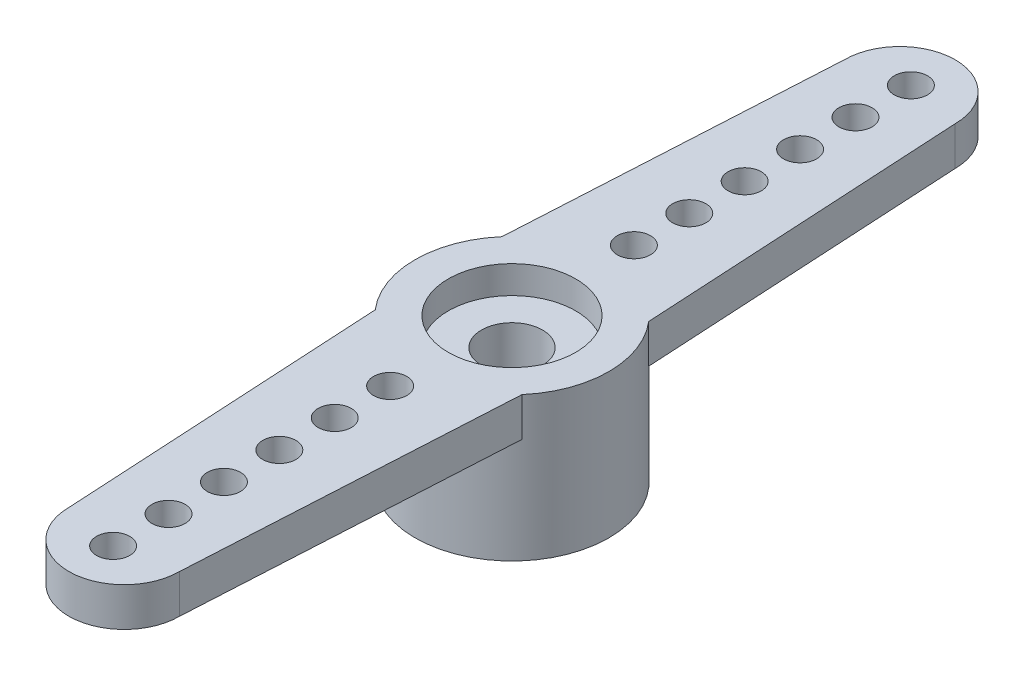
ISO-10303-21;
HEADER;
FILE_DESCRIPTION(('STEP AP214'),'2;1');
FILE_NAME('part.step','',(''),(''),'','','');
FILE_SCHEMA(('AUTOMOTIVE_DESIGN { 1 0 10303 214 1 1 1 1 }'));
ENDSEC;
DATA;
#1=APPLICATION_CONTEXT('core data for automotive mechanical design processes');
#2=APPLICATION_PROTOCOL_DEFINITION('international standard','automotive_design',2000,#1);
#3=PRODUCT_CONTEXT('',#1,'mechanical');
#4=PRODUCT('Part','Part','',(#3));
#5=PRODUCT_RELATED_PRODUCT_CATEGORY('part','',(#4));
#6=PRODUCT_DEFINITION_FORMATION('','',#4);
#7=PRODUCT_DEFINITION_CONTEXT('part definition',#1,'design');
#8=PRODUCT_DEFINITION('design','',#6,#7);
#9=PRODUCT_DEFINITION_SHAPE('','',#8);
#10=(LENGTH_UNIT() NAMED_UNIT(*) SI_UNIT(.MILLI.,.METRE.));
#11=(NAMED_UNIT(*) PLANE_ANGLE_UNIT() SI_UNIT($,.RADIAN.));
#12=(NAMED_UNIT(*) SI_UNIT($,.STERADIAN.) SOLID_ANGLE_UNIT());
#13=UNCERTAINTY_MEASURE_WITH_UNIT(LENGTH_MEASURE(1.E-05),#10,'distance_accuracy_value','');
#14=(GEOMETRIC_REPRESENTATION_CONTEXT(3) GLOBAL_UNCERTAINTY_ASSIGNED_CONTEXT((#13)) GLOBAL_UNIT_ASSIGNED_CONTEXT((#10,
#11,#12)) REPRESENTATION_CONTEXT('',''));
#15=CARTESIAN_POINT('',(0.,0.,0.));
#16=DIRECTION('',(0.,0.,1.));
#17=DIRECTION('',(1.,0.,0.));
#18=AXIS2_PLACEMENT_3D('',#15,#16,#17);
#19=CARTESIAN_POINT('',(0.,-1.4,0.));
#20=DIRECTION('',(0.,1.,0.));
#21=DIRECTION('',(0.,0.,1.));
#22=AXIS2_PLACEMENT_3D('',#19,#20,#21);
#23=PLANE('',#22);
#24=CARTESIAN_POINT('',(0.,-1.4,0.));
#25=DIRECTION('',(0.,-1.,0.));
#26=DIRECTION('',(0.,0.,-1.));
#27=AXIS2_PLACEMENT_3D('',#24,#25,#26);
#28=CIRCLE('',#27,3.5);
#29=CARTESIAN_POINT('',(2.65,-1.4,2.28637267303474));
#30=VERTEX_POINT('',#29);
#31=CARTESIAN_POINT('',(-2.65,-1.4,2.28637267303474));
#32=VERTEX_POINT('',#31);
#33=EDGE_CURVE('E11',#30,#32,#28,.T.);
#34=ORIENTED_EDGE('',*,*,#33,.F.);
#35=DIRECTION('',(0.0554056854716384,0.,-0.998463925245884));
#36=VECTOR('',#35,1.);
#37=CARTESIAN_POINT('',(2.76834851479215,-1.4,0.153618216150051));
#38=LINE('',#37,#36);
#39=CARTESIAN_POINT('',(2.,-1.4,14.));
#40=VERTEX_POINT('',#39);
#41=EDGE_CURVE('E119',#40,#30,#38,.T.);
#42=ORIENTED_EDGE('',*,*,#41,.F.);
#43=CARTESIAN_POINT('',(0.,-1.4,14.));
#44=DIRECTION('',(0.,1.,0.));
#45=DIRECTION('',(0.,0.,1.));
#46=AXIS2_PLACEMENT_3D('',#43,#44,#45);
#47=CIRCLE('',#46,2.);
#48=CARTESIAN_POINT('',(-2.,-1.4,14.));
#49=VERTEX_POINT('',#48);
#50=EDGE_CURVE('E113',#40,#49,#47,.F.);
#51=ORIENTED_EDGE('',*,*,#50,.T.);
#52=DIRECTION('',(-0.0554056854716381,0.,-0.998463925245884));
#53=VECTOR('',#52,1.);
#54=CARTESIAN_POINT('',(-2.76834851479215,-1.4,0.15361821615005));
#55=LINE('',#54,#53);
#56=EDGE_CURVE('E117',#49,#32,#55,.T.);
#57=ORIENTED_EDGE('',*,*,#56,.T.);
#58=EDGE_LOOP('',(#34,#42,#51,#57));
#59=FACE_BOUND('',#58,.T.);
#60=CARTESIAN_POINT('',(0.,-1.4,14.4));
#61=DIRECTION('',(0.,1.,0.));
#62=DIRECTION('',(0.,0.,1.));
#63=AXIS2_PLACEMENT_3D('',#60,#61,#62);
#64=CIRCLE('',#63,0.6);
#65=CARTESIAN_POINT('',(0.,-1.4,15.));
#66=VERTEX_POINT('',#65);
#67=EDGE_CURVE('E172',#66,#66,#64,.F.);
#68=ORIENTED_EDGE('',*,*,#67,.F.);
#69=EDGE_LOOP('',(#68));
#70=FACE_BOUND('',#69,.T.);
#71=CARTESIAN_POINT('',(0.,-1.4,10.4));
#72=DIRECTION('',(0.,1.,0.));
#73=DIRECTION('',(0.,0.,1.));
#74=AXIS2_PLACEMENT_3D('',#71,#72,#73);
#75=CIRCLE('',#74,0.6);
#76=CARTESIAN_POINT('',(0.,-1.4,11.));
#77=VERTEX_POINT('',#76);
#78=EDGE_CURVE('E169',#77,#77,#75,.F.);
#79=ORIENTED_EDGE('',*,*,#78,.F.);
#80=EDGE_LOOP('',(#79));
#81=FACE_BOUND('',#80,.T.);
#82=CARTESIAN_POINT('',(0.,-1.4,6.4));
#83=DIRECTION('',(0.,1.,0.));
#84=DIRECTION('',(0.,0.,1.));
#85=AXIS2_PLACEMENT_3D('',#82,#83,#84);
#86=CIRCLE('',#85,0.6);
#87=CARTESIAN_POINT('',(0.,-1.4,7.));
#88=VERTEX_POINT('',#87);
#89=EDGE_CURVE('E166',#88,#88,#86,.F.);
#90=ORIENTED_EDGE('',*,*,#89,.F.);
#91=EDGE_LOOP('',(#90));
#92=FACE_BOUND('',#91,.T.);
#93=CARTESIAN_POINT('',(0.,-1.4,4.4));
#94=DIRECTION('',(0.,1.,0.));
#95=DIRECTION('',(0.,0.,1.));
#96=AXIS2_PLACEMENT_3D('',#93,#94,#95);
#97=CIRCLE('',#96,0.6);
#98=CARTESIAN_POINT('',(0.,-1.4,5.));
#99=VERTEX_POINT('',#98);
#100=EDGE_CURVE('E145',#99,#99,#97,.F.);
#101=ORIENTED_EDGE('',*,*,#100,.F.);
#102=EDGE_LOOP('',(#101));
#103=FACE_BOUND('',#102,.T.);
#104=CARTESIAN_POINT('',(0.,-1.4,8.4));
#105=DIRECTION('',(0.,1.,0.));
#106=DIRECTION('',(0.,0.,1.));
#107=AXIS2_PLACEMENT_3D('',#104,#105,#106);
#108=CIRCLE('',#107,0.6);
#109=CARTESIAN_POINT('',(0.,-1.4,9.));
#110=VERTEX_POINT('',#109);
#111=EDGE_CURVE('E142',#110,#110,#108,.F.);
#112=ORIENTED_EDGE('',*,*,#111,.F.);
#113=EDGE_LOOP('',(#112));
#114=FACE_BOUND('',#113,.T.);
#115=CARTESIAN_POINT('',(0.,-1.4,12.4));
#116=DIRECTION('',(0.,1.,0.));
#117=DIRECTION('',(0.,0.,1.));
#118=AXIS2_PLACEMENT_3D('',#115,#116,#117);
#119=CIRCLE('',#118,0.6);
#120=CARTESIAN_POINT('',(0.,-1.4,13.));
#121=VERTEX_POINT('',#120);
#122=EDGE_CURVE('E139',#121,#121,#119,.F.);
#123=ORIENTED_EDGE('',*,*,#122,.F.);
#124=EDGE_LOOP('',(#123));
#125=FACE_BOUND('',#124,.T.);
#126=ADVANCED_FACE('F41',(#59,#70,#81,#92,#103,#114,#125),#23,.F.);
#127=CARTESIAN_POINT('',(2.76834851479215,-1.4,0.153618216150051));
#128=DIRECTION('',(0.998463925245884,0.,0.0554056854716383));
#129=DIRECTION('',(0.0554056854716384,0.,-0.998463925245884));
#130=AXIS2_PLACEMENT_3D('',#127,#128,#129);
#131=PLANE('',#130);
#132=DIRECTION('',(0.0554056854716384,0.,-0.998463925245884));
#133=VECTOR('',#132,1.);
#134=CARTESIAN_POINT('',(2.76834851479215,0.,0.153618216150051));
#135=LINE('',#134,#133);
#136=CARTESIAN_POINT('',(2.,0.,14.));
#137=VERTEX_POINT('',#136);
#138=CARTESIAN_POINT('',(2.65,0.,2.28637267303474));
#139=VERTEX_POINT('',#138);
#140=EDGE_CURVE('E192',#137,#139,#135,.T.);
#141=ORIENTED_EDGE('',*,*,#140,.F.);
#142=DIRECTION('',(0.,1.,0.));
#143=VECTOR('',#142,1.);
#144=CARTESIAN_POINT('',(2.,-1.4,14.));
#145=LINE('',#144,#143);
#146=EDGE_CURVE('E87',#40,#137,#145,.T.);
#147=ORIENTED_EDGE('',*,*,#146,.F.);
#148=ORIENTED_EDGE('',*,*,#41,.T.);
#149=DIRECTION('',(0.,1.,0.));
#150=VECTOR('',#149,1.);
#151=CARTESIAN_POINT('',(2.65,-1.4,2.28637267303474));
#152=LINE('',#151,#150);
#153=EDGE_CURVE('E94',#30,#139,#152,.T.);
#154=ORIENTED_EDGE('',*,*,#153,.T.);
#155=EDGE_LOOP('',(#141,#147,#148,#154));
#156=FACE_BOUND('',#155,.T.);
#157=ADVANCED_FACE('F253',(#156),#131,.T.);
#158=CARTESIAN_POINT('',(0.,-1.4,14.));
#159=DIRECTION('',(0.,1.,0.));
#160=DIRECTION('',(0.,0.,1.));
#161=AXIS2_PLACEMENT_3D('',#158,#159,#160);
#162=CYLINDRICAL_SURFACE('',#161,2.);
#163=CARTESIAN_POINT('',(0.,0.,14.));
#164=DIRECTION('',(0.,1.,0.));
#165=DIRECTION('',(0.,0.,1.));
#166=AXIS2_PLACEMENT_3D('',#163,#164,#165);
#167=CIRCLE('',#166,2.);
#168=CARTESIAN_POINT('',(-2.,0.,14.));
#169=VERTEX_POINT('',#168);
#170=EDGE_CURVE('E124',#137,#169,#167,.F.);
#171=ORIENTED_EDGE('',*,*,#170,.T.);
#172=DIRECTION('',(0.,1.,0.));
#173=VECTOR('',#172,1.);
#174=CARTESIAN_POINT('',(-2.,-1.4,14.));
#175=LINE('',#174,#173);
#176=EDGE_CURVE('E122',#49,#169,#175,.T.);
#177=ORIENTED_EDGE('',*,*,#176,.F.);
#178=ORIENTED_EDGE('',*,*,#50,.F.);
#179=ORIENTED_EDGE('',*,*,#146,.T.);
#180=EDGE_LOOP('',(#171,#177,#178,#179));
#181=FACE_BOUND('',#180,.T.);
#182=ADVANCED_FACE('F123',(#181),#162,.T.);
#183=CARTESIAN_POINT('',(-2.76834851479215,-1.4,0.15361821615005));
#184=DIRECTION('',(0.998463925245884,0.,-0.0554056854716381));
#185=DIRECTION('',(-0.0554056854716381,0.,-0.998463925245884));
#186=AXIS2_PLACEMENT_3D('',#183,#184,#185);
#187=PLANE('',#186);
#188=DIRECTION('',(-0.0554056854716381,0.,-0.998463925245884));
#189=VECTOR('',#188,1.);
#190=CARTESIAN_POINT('',(-2.76834851479215,0.,0.15361821615005));
#191=LINE('',#190,#189);
#192=CARTESIAN_POINT('',(-2.65,0.,2.28637267303474));
#193=VERTEX_POINT('',#192);
#194=EDGE_CURVE('E189',#169,#193,#191,.T.);
#195=ORIENTED_EDGE('',*,*,#194,.T.);
#196=DIRECTION('',(0.,1.,0.));
#197=VECTOR('',#196,1.);
#198=CARTESIAN_POINT('',(-2.65,-1.4,2.28637267303474));
#199=LINE('',#198,#197);
#200=EDGE_CURVE('E128',#32,#193,#199,.T.);
#201=ORIENTED_EDGE('',*,*,#200,.F.);
#202=ORIENTED_EDGE('',*,*,#56,.F.);
#203=ORIENTED_EDGE('',*,*,#176,.T.);
#204=EDGE_LOOP('',(#195,#201,#202,#203));
#205=FACE_BOUND('',#204,.T.);
#206=ADVANCED_FACE('F130',(#205),#187,.F.);
#207=CARTESIAN_POINT('',(0.,-1.4,0.));
#208=DIRECTION('',(0.,1.,0.));
#209=DIRECTION('',(0.,0.,1.));
#210=AXIS2_PLACEMENT_3D('',#207,#208,#209);
#211=CYLINDRICAL_SURFACE('',#210,3.5);
#212=CARTESIAN_POINT('',(0.,0.,0.));
#213=DIRECTION('',(0.,1.,0.));
#214=DIRECTION('',(0.,0.,1.));
#215=AXIS2_PLACEMENT_3D('',#212,#213,#214);
#216=CIRCLE('',#215,3.5);
#217=CARTESIAN_POINT('',(-2.65,0.,-2.28637267303474));
#218=VERTEX_POINT('',#217);
#219=EDGE_CURVE('E186',#218,#193,#216,.T.);
#220=ORIENTED_EDGE('',*,*,#219,.F.);
#221=DIRECTION('',(0.,1.,0.));
#222=VECTOR('',#221,1.);
#223=CARTESIAN_POINT('',(-2.65,-1.4,-2.28637267303474));
#224=LINE('',#223,#222);
#225=CARTESIAN_POINT('',(-2.65,-1.4,-2.28637267303474));
#226=VERTEX_POINT('',#225);
#227=EDGE_CURVE('E235',#226,#218,#224,.T.);
#228=ORIENTED_EDGE('',*,*,#227,.F.);
#229=CARTESIAN_POINT('',(2.65,-1.4,-2.28637267303474));
#230=VERTEX_POINT('',#229);
#231=EDGE_CURVE('E51',#226,#230,#28,.T.);
#232=ORIENTED_EDGE('',*,*,#231,.T.);
#233=DIRECTION('',(0.,1.,0.));
#234=VECTOR('',#233,1.);
#235=CARTESIAN_POINT('',(2.65,-1.4,-2.28637267303474));
#236=LINE('',#235,#234);
#237=CARTESIAN_POINT('',(2.65,0.,-2.28637267303474));
#238=VERTEX_POINT('',#237);
#239=EDGE_CURVE('E45',#230,#238,#236,.T.);
#240=ORIENTED_EDGE('',*,*,#239,.T.);
#241=CARTESIAN_POINT('',(0.,0.,0.));
#242=DIRECTION('',(0.,1.,0.));
#243=DIRECTION('',(0.,0.,1.));
#244=AXIS2_PLACEMENT_3D('',#241,#242,#243);
#245=CIRCLE('',#244,3.5);
#246=EDGE_CURVE('E175',#238,#139,#245,.F.);
#247=ORIENTED_EDGE('',*,*,#246,.T.);
#248=ORIENTED_EDGE('',*,*,#153,.F.);
#249=ORIENTED_EDGE('',*,*,#33,.T.);
#250=ORIENTED_EDGE('',*,*,#200,.T.);
#251=EDGE_LOOP('',(#220,#228,#232,#240,#247,#248,#249,#250));
#252=FACE_BOUND('',#251,.T.);
#253=CARTESIAN_POINT('',(0.,-5.2,0.));
#254=DIRECTION('',(0.,-1.,0.));
#255=DIRECTION('',(0.,0.,-1.));
#256=AXIS2_PLACEMENT_3D('',#253,#254,#255);
#257=CIRCLE('',#256,3.5);
#258=CARTESIAN_POINT('',(0.,-5.2,-3.5));
#259=VERTEX_POINT('',#258);
#260=EDGE_CURVE('E178',#259,#259,#257,.T.);
#261=ORIENTED_EDGE('',*,*,#260,.F.);
#262=EDGE_LOOP('',(#261));
#263=FACE_BOUND('',#262,.T.);
#264=ADVANCED_FACE('F246',(#252,#263),#211,.T.);
#265=CARTESIAN_POINT('',(-2.76834851479215,-1.4,-0.15361821615005));
#266=DIRECTION('',(-0.998463925245884,0.,-0.0554056854716381));
#267=DIRECTION('',(-0.0554056854716381,0.,0.998463925245884));
#268=AXIS2_PLACEMENT_3D('',#265,#266,#267);
#269=PLANE('',#268);
#270=DIRECTION('',(-0.0554056854716381,0.,0.998463925245884));
#271=VECTOR('',#270,1.);
#272=CARTESIAN_POINT('',(-2.76834851479215,0.,-0.15361821615005));
#273=LINE('',#272,#271);
#274=CARTESIAN_POINT('',(-2.,0.,-14.));
#275=VERTEX_POINT('',#274);
#276=EDGE_CURVE('E183',#275,#218,#273,.T.);
#277=ORIENTED_EDGE('',*,*,#276,.F.);
#278=DIRECTION('',(0.,1.,0.));
#279=VECTOR('',#278,1.);
#280=CARTESIAN_POINT('',(-2.,-1.4,-14.));
#281=LINE('',#280,#279);
#282=CARTESIAN_POINT('',(-2.,-1.4,-14.));
#283=VERTEX_POINT('',#282);
#284=EDGE_CURVE('E237',#283,#275,#281,.T.);
#285=ORIENTED_EDGE('',*,*,#284,.F.);
#286=DIRECTION('',(-0.0554056854716381,0.,0.998463925245884));
#287=VECTOR('',#286,1.);
#288=CARTESIAN_POINT('',(-2.76834851479215,-1.4,-0.15361821615005));
#289=LINE('',#288,#287);
#290=EDGE_CURVE('E131',#283,#226,#289,.T.);
#291=ORIENTED_EDGE('',*,*,#290,.T.);
#292=ORIENTED_EDGE('',*,*,#227,.T.);
#293=EDGE_LOOP('',(#277,#285,#291,#292));
#294=FACE_BOUND('',#293,.T.);
#295=ADVANCED_FACE('F271',(#294),#269,.T.);
#296=CARTESIAN_POINT('',(0.,-1.4,-14.));
#297=DIRECTION('',(0.,1.,0.));
#298=DIRECTION('',(0.,0.,1.));
#299=AXIS2_PLACEMENT_3D('',#296,#297,#298);
#300=CYLINDRICAL_SURFACE('',#299,2.);
#301=CARTESIAN_POINT('',(0.,0.,-14.));
#302=DIRECTION('',(0.,1.,0.));
#303=DIRECTION('',(0.,0.,1.));
#304=AXIS2_PLACEMENT_3D('',#301,#302,#303);
#305=CIRCLE('',#304,2.);
#306=CARTESIAN_POINT('',(2.,0.,-14.));
#307=VERTEX_POINT('',#306);
#308=EDGE_CURVE('E180',#307,#275,#305,.T.);
#309=ORIENTED_EDGE('',*,*,#308,.F.);
#310=DIRECTION('',(0.,1.,0.));
#311=VECTOR('',#310,1.);
#312=CARTESIAN_POINT('',(2.,-1.4,-14.));
#313=LINE('',#312,#311);
#314=CARTESIAN_POINT('',(2.,-1.4,-14.));
#315=VERTEX_POINT('',#314);
#316=EDGE_CURVE('E102',#315,#307,#313,.T.);
#317=ORIENTED_EDGE('',*,*,#316,.F.);
#318=CARTESIAN_POINT('',(0.,-1.4,-14.));
#319=DIRECTION('',(0.,1.,0.));
#320=DIRECTION('',(0.,0.,1.));
#321=AXIS2_PLACEMENT_3D('',#318,#319,#320);
#322=CIRCLE('',#321,2.);
#323=EDGE_CURVE('E134',#315,#283,#322,.T.);
#324=ORIENTED_EDGE('',*,*,#323,.T.);
#325=ORIENTED_EDGE('',*,*,#284,.T.);
#326=EDGE_LOOP('',(#309,#317,#324,#325));
#327=FACE_BOUND('',#326,.T.);
#328=ADVANCED_FACE('F273',(#327),#300,.T.);
#329=CARTESIAN_POINT('',(0.,-1.4,10.4));
#330=DIRECTION('',(0.,1.,0.));
#331=DIRECTION('',(0.,0.,1.));
#332=AXIS2_PLACEMENT_3D('',#329,#330,#331);
#333=CYLINDRICAL_SURFACE('',#332,0.6);
#334=ORIENTED_EDGE('',*,*,#78,.T.);
#335=EDGE_LOOP('',(#334));
#336=FACE_BOUND('',#335,.T.);
#337=CARTESIAN_POINT('',(0.,0.,10.4));
#338=DIRECTION('',(0.,1.,0.));
#339=DIRECTION('',(0.,0.,1.));
#340=AXIS2_PLACEMENT_3D('',#337,#338,#339);
#341=CIRCLE('',#340,0.6);
#342=CARTESIAN_POINT('',(0.,0.,11.));
#343=VERTEX_POINT('',#342);
#344=EDGE_CURVE('E225',#343,#343,#341,.F.);
#345=ORIENTED_EDGE('',*,*,#344,.F.);
#346=EDGE_LOOP('',(#345));
#347=FACE_BOUND('',#346,.T.);
#348=ADVANCED_FACE('F276',(#336,#347),#333,.F.);
#349=CARTESIAN_POINT('',(0.,-1.4,6.4));
#350=DIRECTION('',(0.,1.,0.));
#351=DIRECTION('',(0.,0.,1.));
#352=AXIS2_PLACEMENT_3D('',#349,#350,#351);
#353=CYLINDRICAL_SURFACE('',#352,0.6);
#354=ORIENTED_EDGE('',*,*,#89,.T.);
#355=EDGE_LOOP('',(#354));
#356=FACE_BOUND('',#355,.T.);
#357=CARTESIAN_POINT('',(0.,0.,6.4));
#358=DIRECTION('',(0.,1.,0.));
#359=DIRECTION('',(0.,0.,1.));
#360=AXIS2_PLACEMENT_3D('',#357,#358,#359);
#361=CIRCLE('',#360,0.6);
#362=CARTESIAN_POINT('',(0.,0.,7.));
#363=VERTEX_POINT('',#362);
#364=EDGE_CURVE('E222',#363,#363,#361,.F.);
#365=ORIENTED_EDGE('',*,*,#364,.F.);
#366=EDGE_LOOP('',(#365));
#367=FACE_BOUND('',#366,.T.);
#368=ADVANCED_FACE('F280',(#356,#367),#353,.F.);
#369=CARTESIAN_POINT('',(0.,-1.4,-14.4));
#370=DIRECTION('',(0.,1.,0.));
#371=DIRECTION('',(0.,0.,1.));
#372=AXIS2_PLACEMENT_3D('',#369,#370,#371);
#373=CYLINDRICAL_SURFACE('',#372,0.6);
#374=CARTESIAN_POINT('',(0.,-1.4,-14.4));
#375=DIRECTION('',(0.,1.,0.));
#376=DIRECTION('',(0.,0.,1.));
#377=AXIS2_PLACEMENT_3D('',#374,#375,#376);
#378=CIRCLE('',#377,0.6);
#379=CARTESIAN_POINT('',(0.,-1.4,-13.8));
#380=VERTEX_POINT('',#379);
#381=EDGE_CURVE('E163',#380,#380,#378,.T.);
#382=ORIENTED_EDGE('',*,*,#381,.F.);
#383=EDGE_LOOP('',(#382));
#384=FACE_BOUND('',#383,.T.);
#385=CARTESIAN_POINT('',(0.,0.,-14.4));
#386=DIRECTION('',(0.,1.,0.));
#387=DIRECTION('',(0.,0.,1.));
#388=AXIS2_PLACEMENT_3D('',#385,#386,#387);
#389=CIRCLE('',#388,0.6);
#390=CARTESIAN_POINT('',(0.,0.,-13.8));
#391=VERTEX_POINT('',#390);
#392=EDGE_CURVE('E219',#391,#391,#389,.T.);
#393=ORIENTED_EDGE('',*,*,#392,.T.);
#394=EDGE_LOOP('',(#393));
#395=FACE_BOUND('',#394,.T.);
#396=ADVANCED_FACE('F342',(#384,#395),#373,.F.);
#397=CARTESIAN_POINT('',(0.,-1.4,-12.4));
#398=DIRECTION('',(0.,1.,0.));
#399=DIRECTION('',(0.,0.,1.));
#400=AXIS2_PLACEMENT_3D('',#397,#398,#399);
#401=CYLINDRICAL_SURFACE('',#400,0.6);
#402=CARTESIAN_POINT('',(0.,-1.4,-12.4));
#403=DIRECTION('',(0.,1.,0.));
#404=DIRECTION('',(0.,0.,1.));
#405=AXIS2_PLACEMENT_3D('',#402,#403,#404);
#406=CIRCLE('',#405,0.6);
#407=CARTESIAN_POINT('',(0.,-1.4,-11.8));
#408=VERTEX_POINT('',#407);
#409=EDGE_CURVE('E160',#408,#408,#406,.T.);
#410=ORIENTED_EDGE('',*,*,#409,.F.);
#411=EDGE_LOOP('',(#410));
#412=FACE_BOUND('',#411,.T.);
#413=CARTESIAN_POINT('',(0.,0.,-12.4));
#414=DIRECTION('',(0.,1.,0.));
#415=DIRECTION('',(0.,0.,1.));
#416=AXIS2_PLACEMENT_3D('',#413,#414,#415);
#417=CIRCLE('',#416,0.6);
#418=CARTESIAN_POINT('',(0.,0.,-11.8));
#419=VERTEX_POINT('',#418);
#420=EDGE_CURVE('E216',#419,#419,#417,.T.);
#421=ORIENTED_EDGE('',*,*,#420,.T.);
#422=EDGE_LOOP('',(#421));
#423=FACE_BOUND('',#422,.T.);
#424=ADVANCED_FACE('F346',(#412,#423),#401,.F.);
#425=CARTESIAN_POINT('',(0.,-1.4,-10.4));
#426=DIRECTION('',(0.,1.,0.));
#427=DIRECTION('',(0.,0.,1.));
#428=AXIS2_PLACEMENT_3D('',#425,#426,#427);
#429=CYLINDRICAL_SURFACE('',#428,0.6);
#430=CARTESIAN_POINT('',(0.,-1.4,-10.4));
#431=DIRECTION('',(0.,1.,0.));
#432=DIRECTION('',(0.,0.,1.));
#433=AXIS2_PLACEMENT_3D('',#430,#431,#432);
#434=CIRCLE('',#433,0.6);
#435=CARTESIAN_POINT('',(0.,-1.4,-9.8));
#436=VERTEX_POINT('',#435);
#437=EDGE_CURVE('E157',#436,#436,#434,.T.);
#438=ORIENTED_EDGE('',*,*,#437,.F.);
#439=EDGE_LOOP('',(#438));
#440=FACE_BOUND('',#439,.T.);
#441=CARTESIAN_POINT('',(0.,0.,-10.4));
#442=DIRECTION('',(0.,1.,0.));
#443=DIRECTION('',(0.,0.,1.));
#444=AXIS2_PLACEMENT_3D('',#441,#442,#443);
#445=CIRCLE('',#444,0.6);
#446=CARTESIAN_POINT('',(0.,0.,-9.8));
#447=VERTEX_POINT('',#446);
#448=EDGE_CURVE('E213',#447,#447,#445,.T.);
#449=ORIENTED_EDGE('',*,*,#448,.T.);
#450=EDGE_LOOP('',(#449));
#451=FACE_BOUND('',#450,.T.);
#452=ADVANCED_FACE('F350',(#440,#451),#429,.F.);
#453=CARTESIAN_POINT('',(0.,-1.4,-8.4));
#454=DIRECTION('',(0.,1.,0.));
#455=DIRECTION('',(0.,0.,1.));
#456=AXIS2_PLACEMENT_3D('',#453,#454,#455);
#457=CYLINDRICAL_SURFACE('',#456,0.6);
#458=CARTESIAN_POINT('',(0.,-1.4,-8.4));
#459=DIRECTION('',(0.,1.,0.));
#460=DIRECTION('',(0.,0.,1.));
#461=AXIS2_PLACEMENT_3D('',#458,#459,#460);
#462=CIRCLE('',#461,0.6);
#463=CARTESIAN_POINT('',(0.,-1.4,-7.8));
#464=VERTEX_POINT('',#463);
#465=EDGE_CURVE('E154',#464,#464,#462,.T.);
#466=ORIENTED_EDGE('',*,*,#465,.F.);
#467=EDGE_LOOP('',(#466));
#468=FACE_BOUND('',#467,.T.);
#469=CARTESIAN_POINT('',(0.,0.,-8.4));
#470=DIRECTION('',(0.,1.,0.));
#471=DIRECTION('',(0.,0.,1.));
#472=AXIS2_PLACEMENT_3D('',#469,#470,#471);
#473=CIRCLE('',#472,0.6);
#474=CARTESIAN_POINT('',(0.,0.,-7.8));
#475=VERTEX_POINT('',#474);
#476=EDGE_CURVE('E210',#475,#475,#473,.T.);
#477=ORIENTED_EDGE('',*,*,#476,.T.);
#478=EDGE_LOOP('',(#477));
#479=FACE_BOUND('',#478,.T.);
#480=ADVANCED_FACE('F354',(#468,#479),#457,.F.);
#481=CARTESIAN_POINT('',(0.,-1.4,-6.4));
#482=DIRECTION('',(0.,1.,0.));
#483=DIRECTION('',(0.,0.,1.));
#484=AXIS2_PLACEMENT_3D('',#481,#482,#483);
#485=CYLINDRICAL_SURFACE('',#484,0.6);
#486=CARTESIAN_POINT('',(0.,-1.4,-6.4));
#487=DIRECTION('',(0.,1.,0.));
#488=DIRECTION('',(0.,0.,1.));
#489=AXIS2_PLACEMENT_3D('',#486,#487,#488);
#490=CIRCLE('',#489,0.6);
#491=CARTESIAN_POINT('',(0.,-1.4,-5.8));
#492=VERTEX_POINT('',#491);
#493=EDGE_CURVE('E151',#492,#492,#490,.T.);
#494=ORIENTED_EDGE('',*,*,#493,.F.);
#495=EDGE_LOOP('',(#494));
#496=FACE_BOUND('',#495,.T.);
#497=CARTESIAN_POINT('',(0.,0.,-6.4));
#498=DIRECTION('',(0.,1.,0.));
#499=DIRECTION('',(0.,0.,1.));
#500=AXIS2_PLACEMENT_3D('',#497,#498,#499);
#501=CIRCLE('',#500,0.6);
#502=CARTESIAN_POINT('',(0.,0.,-5.8));
#503=VERTEX_POINT('',#502);
#504=EDGE_CURVE('E207',#503,#503,#501,.T.);
#505=ORIENTED_EDGE('',*,*,#504,.T.);
#506=EDGE_LOOP('',(#505));
#507=FACE_BOUND('',#506,.T.);
#508=ADVANCED_FACE('F358',(#496,#507),#485,.F.);
#509=CARTESIAN_POINT('',(0.,-1.4,-4.4));
#510=DIRECTION('',(0.,1.,0.));
#511=DIRECTION('',(0.,0.,1.));
#512=AXIS2_PLACEMENT_3D('',#509,#510,#511);
#513=CYLINDRICAL_SURFACE('',#512,0.6);
#514=CARTESIAN_POINT('',(0.,-1.4,-4.4));
#515=DIRECTION('',(0.,1.,0.));
#516=DIRECTION('',(0.,0.,1.));
#517=AXIS2_PLACEMENT_3D('',#514,#515,#516);
#518=CIRCLE('',#517,0.6);
#519=CARTESIAN_POINT('',(0.,-1.4,-3.8));
#520=VERTEX_POINT('',#519);
#521=EDGE_CURVE('E148',#520,#520,#518,.T.);
#522=ORIENTED_EDGE('',*,*,#521,.F.);
#523=EDGE_LOOP('',(#522));
#524=FACE_BOUND('',#523,.T.);
#525=CARTESIAN_POINT('',(0.,0.,-4.4));
#526=DIRECTION('',(0.,1.,0.));
#527=DIRECTION('',(0.,0.,1.));
#528=AXIS2_PLACEMENT_3D('',#525,#526,#527);
#529=CIRCLE('',#528,0.6);
#530=CARTESIAN_POINT('',(0.,0.,-3.8));
#531=VERTEX_POINT('',#530);
#532=EDGE_CURVE('E204',#531,#531,#529,.T.);
#533=ORIENTED_EDGE('',*,*,#532,.T.);
#534=EDGE_LOOP('',(#533));
#535=FACE_BOUND('',#534,.T.);
#536=ADVANCED_FACE('F362',(#524,#535),#513,.F.);
#537=CARTESIAN_POINT('',(0.,-1.4,4.4));
#538=DIRECTION('',(0.,1.,0.));
#539=DIRECTION('',(0.,0.,1.));
#540=AXIS2_PLACEMENT_3D('',#537,#538,#539);
#541=CYLINDRICAL_SURFACE('',#540,0.6);
#542=ORIENTED_EDGE('',*,*,#100,.T.);
#543=EDGE_LOOP('',(#542));
#544=FACE_BOUND('',#543,.T.);
#545=CARTESIAN_POINT('',(0.,0.,4.4));
#546=DIRECTION('',(0.,1.,0.));
#547=DIRECTION('',(0.,0.,1.));
#548=AXIS2_PLACEMENT_3D('',#545,#546,#547);
#549=CIRCLE('',#548,0.6);
#550=CARTESIAN_POINT('',(0.,0.,5.));
#551=VERTEX_POINT('',#550);
#552=EDGE_CURVE('E201',#551,#551,#549,.F.);
#553=ORIENTED_EDGE('',*,*,#552,.F.);
#554=EDGE_LOOP('',(#553));
#555=FACE_BOUND('',#554,.T.);
#556=ADVANCED_FACE('F366',(#544,#555),#541,.F.);
#557=CARTESIAN_POINT('',(0.,-1.4,8.4));
#558=DIRECTION('',(0.,1.,0.));
#559=DIRECTION('',(0.,0.,1.));
#560=AXIS2_PLACEMENT_3D('',#557,#558,#559);
#561=CYLINDRICAL_SURFACE('',#560,0.6);
#562=ORIENTED_EDGE('',*,*,#111,.T.);
#563=EDGE_LOOP('',(#562));
#564=FACE_BOUND('',#563,.T.);
#565=CARTESIAN_POINT('',(0.,0.,8.4));
#566=DIRECTION('',(0.,1.,0.));
#567=DIRECTION('',(0.,0.,1.));
#568=AXIS2_PLACEMENT_3D('',#565,#566,#567);
#569=CIRCLE('',#568,0.6);
#570=CARTESIAN_POINT('',(0.,0.,9.));
#571=VERTEX_POINT('',#570);
#572=EDGE_CURVE('E198',#571,#571,#569,.F.);
#573=ORIENTED_EDGE('',*,*,#572,.F.);
#574=EDGE_LOOP('',(#573));
#575=FACE_BOUND('',#574,.T.);
#576=ADVANCED_FACE('F369',(#564,#575),#561,.F.);
#577=CARTESIAN_POINT('',(0.,-1.4,12.4));
#578=DIRECTION('',(0.,1.,0.));
#579=DIRECTION('',(0.,0.,1.));
#580=AXIS2_PLACEMENT_3D('',#577,#578,#579);
#581=CYLINDRICAL_SURFACE('',#580,0.6);
#582=ORIENTED_EDGE('',*,*,#122,.T.);
#583=EDGE_LOOP('',(#582));
#584=FACE_BOUND('',#583,.T.);
#585=CARTESIAN_POINT('',(0.,0.,12.4));
#586=DIRECTION('',(0.,1.,0.));
#587=DIRECTION('',(0.,0.,1.));
#588=AXIS2_PLACEMENT_3D('',#585,#586,#587);
#589=CIRCLE('',#588,0.6);
#590=CARTESIAN_POINT('',(0.,0.,13.));
#591=VERTEX_POINT('',#590);
#592=EDGE_CURVE('E195',#591,#591,#589,.F.);
#593=ORIENTED_EDGE('',*,*,#592,.F.);
#594=EDGE_LOOP('',(#593));
#595=FACE_BOUND('',#594,.T.);
#596=ADVANCED_FACE('F265',(#584,#595),#581,.F.);
#597=CARTESIAN_POINT('',(2.76834851479215,-1.4,-0.153618216150051));
#598=DIRECTION('',(-0.998463925245884,0.,0.0554056854716383));
#599=DIRECTION('',(0.0554056854716384,0.,0.998463925245884));
#600=AXIS2_PLACEMENT_3D('',#597,#598,#599);
#601=PLANE('',#600);
#602=DIRECTION('',(0.0554056854716384,0.,0.998463925245884));
#603=VECTOR('',#602,1.);
#604=CARTESIAN_POINT('',(2.76834851479215,0.,-0.153618216150051));
#605=LINE('',#604,#603);
#606=EDGE_CURVE('E177',#307,#238,#605,.T.);
#607=ORIENTED_EDGE('',*,*,#606,.T.);
#608=ORIENTED_EDGE('',*,*,#239,.F.);
#609=DIRECTION('',(0.0554056854716384,0.,0.998463925245884));
#610=VECTOR('',#609,1.);
#611=CARTESIAN_POINT('',(2.76834851479215,-1.4,-0.153618216150051));
#612=LINE('',#611,#610);
#613=EDGE_CURVE('E231',#315,#230,#612,.T.);
#614=ORIENTED_EDGE('',*,*,#613,.F.);
#615=ORIENTED_EDGE('',*,*,#316,.T.);
#616=EDGE_LOOP('',(#607,#608,#614,#615));
#617=FACE_BOUND('',#616,.T.);
#618=ADVANCED_FACE('F43',(#617),#601,.F.);
#619=CARTESIAN_POINT('',(0.,-1.4,14.4));
#620=DIRECTION('',(0.,1.,0.));
#621=DIRECTION('',(0.,0.,1.));
#622=AXIS2_PLACEMENT_3D('',#619,#620,#621);
#623=CYLINDRICAL_SURFACE('',#622,0.6);
#624=ORIENTED_EDGE('',*,*,#67,.T.);
#625=EDGE_LOOP('',(#624));
#626=FACE_BOUND('',#625,.T.);
#627=CARTESIAN_POINT('',(0.,0.,14.4));
#628=DIRECTION('',(0.,1.,0.));
#629=DIRECTION('',(0.,0.,1.));
#630=AXIS2_PLACEMENT_3D('',#627,#628,#629);
#631=CIRCLE('',#630,0.6);
#632=CARTESIAN_POINT('',(0.,0.,15.));
#633=VERTEX_POINT('',#632);
#634=EDGE_CURVE('E228',#633,#633,#631,.F.);
#635=ORIENTED_EDGE('',*,*,#634,.F.);
#636=EDGE_LOOP('',(#635));
#637=FACE_BOUND('',#636,.T.);
#638=ADVANCED_FACE('F335',(#626,#637),#623,.F.);
#639=ORIENTED_EDGE('',*,*,#231,.F.);
#640=ORIENTED_EDGE('',*,*,#290,.F.);
#641=ORIENTED_EDGE('',*,*,#323,.F.);
#642=ORIENTED_EDGE('',*,*,#613,.T.);
#643=EDGE_LOOP('',(#639,#640,#641,#642));
#644=FACE_BOUND('',#643,.T.);
#645=ORIENTED_EDGE('',*,*,#521,.T.);
#646=EDGE_LOOP('',(#645));
#647=FACE_BOUND('',#646,.T.);
#648=ORIENTED_EDGE('',*,*,#493,.T.);
#649=EDGE_LOOP('',(#648));
#650=FACE_BOUND('',#649,.T.);
#651=ORIENTED_EDGE('',*,*,#465,.T.);
#652=EDGE_LOOP('',(#651));
#653=FACE_BOUND('',#652,.T.);
#654=ORIENTED_EDGE('',*,*,#437,.T.);
#655=EDGE_LOOP('',(#654));
#656=FACE_BOUND('',#655,.T.);
#657=ORIENTED_EDGE('',*,*,#409,.T.);
#658=EDGE_LOOP('',(#657));
#659=FACE_BOUND('',#658,.T.);
#660=ORIENTED_EDGE('',*,*,#381,.T.);
#661=EDGE_LOOP('',(#660));
#662=FACE_BOUND('',#661,.T.);
#663=ADVANCED_FACE('F263',(#644,#647,#650,#653,#656,#659,#662),#23,.F.);
#664=CARTESIAN_POINT('',(0.,0.,0.));
#665=DIRECTION('',(0.,1.,0.));
#666=DIRECTION('',(0.,0.,1.));
#667=AXIS2_PLACEMENT_3D('',#664,#665,#666);
#668=PLANE('',#667);
#669=CARTESIAN_POINT('',(0.,0.,0.));
#670=DIRECTION('',(0.,1.,0.));
#671=DIRECTION('',(0.,0.,1.));
#672=AXIS2_PLACEMENT_3D('',#669,#670,#671);
#673=CIRCLE('',#672,2.3);
#674=CARTESIAN_POINT('',(0.,0.,2.3));
#675=VERTEX_POINT('',#674);
#676=EDGE_CURVE('E293',#675,#675,#673,.T.);
#677=ORIENTED_EDGE('',*,*,#676,.F.);
#678=EDGE_LOOP('',(#677));
#679=FACE_BOUND('',#678,.T.);
#680=ORIENTED_EDGE('',*,*,#246,.F.);
#681=ORIENTED_EDGE('',*,*,#606,.F.);
#682=ORIENTED_EDGE('',*,*,#308,.T.);
#683=ORIENTED_EDGE('',*,*,#276,.T.);
#684=ORIENTED_EDGE('',*,*,#219,.T.);
#685=ORIENTED_EDGE('',*,*,#194,.F.);
#686=ORIENTED_EDGE('',*,*,#170,.F.);
#687=ORIENTED_EDGE('',*,*,#140,.T.);
#688=EDGE_LOOP('',(#680,#681,#682,#683,#684,#685,#686,#687));
#689=FACE_BOUND('',#688,.T.);
#690=ORIENTED_EDGE('',*,*,#592,.T.);
#691=EDGE_LOOP('',(#690));
#692=FACE_BOUND('',#691,.T.);
#693=ORIENTED_EDGE('',*,*,#572,.T.);
#694=EDGE_LOOP('',(#693));
#695=FACE_BOUND('',#694,.T.);
#696=ORIENTED_EDGE('',*,*,#552,.T.);
#697=EDGE_LOOP('',(#696));
#698=FACE_BOUND('',#697,.T.);
#699=ORIENTED_EDGE('',*,*,#532,.F.);
#700=EDGE_LOOP('',(#699));
#701=FACE_BOUND('',#700,.T.);
#702=ORIENTED_EDGE('',*,*,#504,.F.);
#703=EDGE_LOOP('',(#702));
#704=FACE_BOUND('',#703,.T.);
#705=ORIENTED_EDGE('',*,*,#476,.F.);
#706=EDGE_LOOP('',(#705));
#707=FACE_BOUND('',#706,.T.);
#708=ORIENTED_EDGE('',*,*,#448,.F.);
#709=EDGE_LOOP('',(#708));
#710=FACE_BOUND('',#709,.T.);
#711=ORIENTED_EDGE('',*,*,#420,.F.);
#712=EDGE_LOOP('',(#711));
#713=FACE_BOUND('',#712,.T.);
#714=ORIENTED_EDGE('',*,*,#392,.F.);
#715=EDGE_LOOP('',(#714));
#716=FACE_BOUND('',#715,.T.);
#717=ORIENTED_EDGE('',*,*,#364,.T.);
#718=EDGE_LOOP('',(#717));
#719=FACE_BOUND('',#718,.T.);
#720=ORIENTED_EDGE('',*,*,#344,.T.);
#721=EDGE_LOOP('',(#720));
#722=FACE_BOUND('',#721,.T.);
#723=ORIENTED_EDGE('',*,*,#634,.T.);
#724=EDGE_LOOP('',(#723));
#725=FACE_BOUND('',#724,.T.);
#726=ADVANCED_FACE('F251',(#679,#689,#692,#695,#698,#701,#704,#707,#710,#713,#716,#719,#722,
#725),#668,.T.);
#727=CARTESIAN_POINT('',(0.,-5.2,0.));
#728=DIRECTION('',(0.,-1.,0.));
#729=DIRECTION('',(0.,0.,-1.));
#730=AXIS2_PLACEMENT_3D('',#727,#728,#729);
#731=PLANE('',#730);
#732=CARTESIAN_POINT('',(0.,-5.2,0.));
#733=DIRECTION('',(0.,-1.,0.));
#734=DIRECTION('',(0.,0.,-1.));
#735=AXIS2_PLACEMENT_3D('',#732,#733,#734);
#736=CIRCLE('',#735,2.5);
#737=CARTESIAN_POINT('',(0.,-5.2,-2.5));
#738=VERTEX_POINT('',#737);
#739=EDGE_CURVE('E299',#738,#738,#736,.T.);
#740=ORIENTED_EDGE('',*,*,#739,.F.);
#741=EDGE_LOOP('',(#740));
#742=FACE_BOUND('',#741,.T.);
#743=ORIENTED_EDGE('',*,*,#260,.T.);
#744=EDGE_LOOP('',(#743));
#745=FACE_BOUND('',#744,.T.);
#746=ADVANCED_FACE('F323',(#742,#745),#731,.T.);
#747=CARTESIAN_POINT('',(0.,-1.,0.));
#748=DIRECTION('',(0.,1.,0.));
#749=DIRECTION('',(0.,0.,1.));
#750=AXIS2_PLACEMENT_3D('',#747,#748,#749);
#751=CYLINDRICAL_SURFACE('',#750,2.3);
#752=CARTESIAN_POINT('',(0.,-1.,0.));
#753=DIRECTION('',(0.,1.,0.));
#754=DIRECTION('',(0.,0.,1.));
#755=AXIS2_PLACEMENT_3D('',#752,#753,#754);
#756=CIRCLE('',#755,2.3);
#757=CARTESIAN_POINT('',(0.,-1.,2.3));
#758=VERTEX_POINT('',#757);
#759=EDGE_CURVE('E292',#758,#758,#756,.T.);
#760=ORIENTED_EDGE('',*,*,#759,.F.);
#761=EDGE_LOOP('',(#760));
#762=FACE_BOUND('',#761,.T.);
#763=ORIENTED_EDGE('',*,*,#676,.T.);
#764=EDGE_LOOP('',(#763));
#765=FACE_BOUND('',#764,.T.);
#766=ADVANCED_FACE('F317',(#762,#765),#751,.F.);
#767=CARTESIAN_POINT('',(0.,-1.,0.));
#768=DIRECTION('',(0.,1.,0.));
#769=DIRECTION('',(0.,0.,1.));
#770=AXIS2_PLACEMENT_3D('',#767,#768,#769);
#771=PLANE('',#770);
#772=CARTESIAN_POINT('',(0.,-1.,0.));
#773=DIRECTION('',(0.,1.,0.));
#774=DIRECTION('',(0.,0.,1.));
#775=AXIS2_PLACEMENT_3D('',#772,#773,#774);
#776=CIRCLE('',#775,1.10218213753583);
#777=CARTESIAN_POINT('',(0.,-1.,1.10218213753583));
#778=VERTEX_POINT('',#777);
#779=EDGE_CURVE('E302',#778,#778,#776,.T.);
#780=ORIENTED_EDGE('',*,*,#779,.F.);
#781=EDGE_LOOP('',(#780));
#782=FACE_BOUND('',#781,.T.);
#783=ORIENTED_EDGE('',*,*,#759,.T.);
#784=EDGE_LOOP('',(#783));
#785=FACE_BOUND('',#784,.T.);
#786=ADVANCED_FACE('F313',(#782,#785),#771,.T.);
#787=CARTESIAN_POINT('',(0.,-3.2,0.));
#788=DIRECTION('',(0.,-1.,0.));
#789=DIRECTION('',(0.,0.,-1.));
#790=AXIS2_PLACEMENT_3D('',#787,#788,#789);
#791=CYLINDRICAL_SURFACE('',#790,2.5);
#792=CARTESIAN_POINT('',(0.,-3.2,0.));
#793=DIRECTION('',(0.,-1.,0.));
#794=DIRECTION('',(0.,0.,-1.));
#795=AXIS2_PLACEMENT_3D('',#792,#793,#794);
#796=CIRCLE('',#795,2.5);
#797=CARTESIAN_POINT('',(0.,-3.2,-2.5));
#798=VERTEX_POINT('',#797);
#799=EDGE_CURVE('E296',#798,#798,#796,.T.);
#800=ORIENTED_EDGE('',*,*,#799,.F.);
#801=EDGE_LOOP('',(#800));
#802=FACE_BOUND('',#801,.T.);
#803=ORIENTED_EDGE('',*,*,#739,.T.);
#804=EDGE_LOOP('',(#803));
#805=FACE_BOUND('',#804,.T.);
#806=ADVANCED_FACE('F316',(#802,#805),#791,.F.);
#807=CARTESIAN_POINT('',(0.,-3.2,0.));
#808=DIRECTION('',(0.,-1.,0.));
#809=DIRECTION('',(0.,0.,-1.));
#810=AXIS2_PLACEMENT_3D('',#807,#808,#809);
#811=PLANE('',#810);
#812=CARTESIAN_POINT('',(0.,-3.2,0.));
#813=DIRECTION('',(0.,-1.,0.));
#814=DIRECTION('',(0.,0.,-1.));
#815=AXIS2_PLACEMENT_3D('',#812,#813,#814);
#816=CIRCLE('',#815,1.10218213753583);
#817=CARTESIAN_POINT('',(0.,-3.2,-1.10218213753583));
#818=VERTEX_POINT('',#817);
#819=EDGE_CURVE('E305',#818,#818,#816,.F.);
#820=ORIENTED_EDGE('',*,*,#819,.T.);
#821=EDGE_LOOP('',(#820));
#822=FACE_BOUND('',#821,.T.);
#823=ORIENTED_EDGE('',*,*,#799,.T.);
#824=EDGE_LOOP('',(#823));
#825=FACE_BOUND('',#824,.T.);
#826=ADVANCED_FACE('F461',(#822,#825),#811,.T.);
#827=CARTESIAN_POINT('',(0.,-5.201,0.));
#828=DIRECTION('',(0.,1.,0.));
#829=DIRECTION('',(0.,0.,1.));
#830=AXIS2_PLACEMENT_3D('',#827,#828,#829);
#831=CYLINDRICAL_SURFACE('',#830,1.10218213753583);
#832=ORIENTED_EDGE('',*,*,#819,.F.);
#833=EDGE_LOOP('',(#832));
#834=FACE_BOUND('',#833,.T.);
#835=ORIENTED_EDGE('',*,*,#779,.T.);
#836=EDGE_LOOP('',(#835));
#837=FACE_BOUND('',#836,.T.);
#838=ADVANCED_FACE('F311',(#834,#837),#831,.F.);
#839=CLOSED_SHELL('',(#126,#157,#182,#206,#264,#295,#328,#348,#368,#396,#424,#452,#480,#508,
#536,#556,#576,#596,#618,#638,#663,#726,#746,#766,#786,#806,#826,#838));
#840=MANIFOLD_SOLID_BREP('B2',#839);
#841=ADVANCED_BREP_SHAPE_REPRESENTATION('',(#18,#840),#14);
#842=SHAPE_DEFINITION_REPRESENTATION(#9,#841);
ENDSEC;
END-ISO-10303-21;
